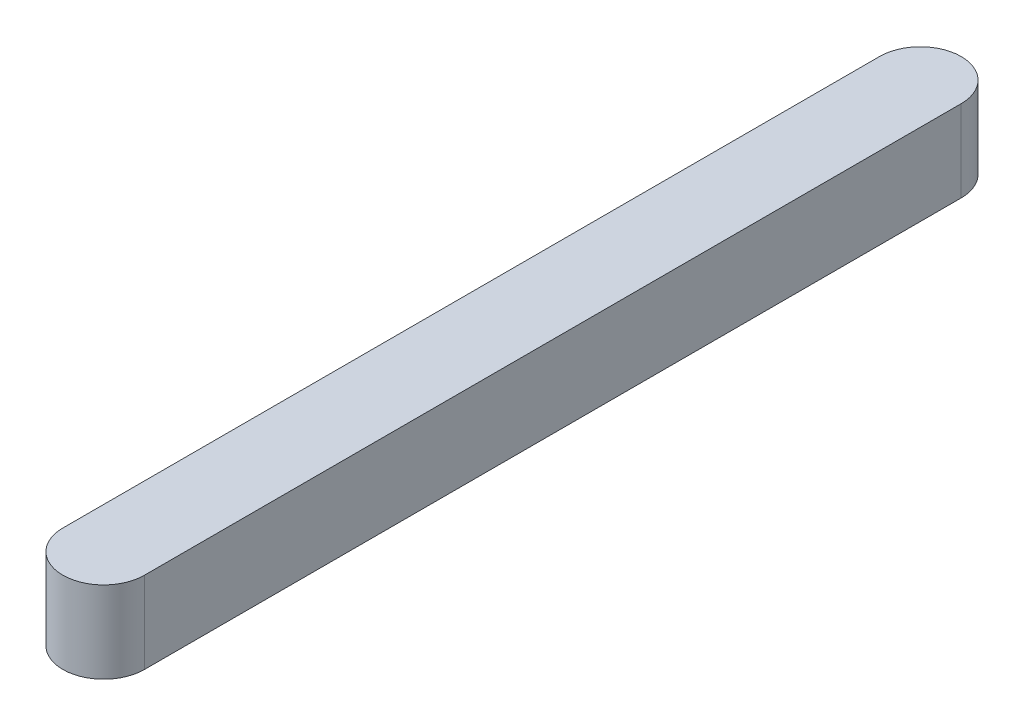
ISO-10303-21;
HEADER;
FILE_DESCRIPTION(('STEP AP214'),'2;1');
FILE_NAME('part.step','',(''),(''),'','','');
FILE_SCHEMA(('AUTOMOTIVE_DESIGN { 1 0 10303 214 1 1 1 1 }'));
ENDSEC;
DATA;
#1=APPLICATION_CONTEXT('core data for automotive mechanical design processes');
#2=APPLICATION_PROTOCOL_DEFINITION('international standard','automotive_design',2000,#1);
#3=PRODUCT_CONTEXT('',#1,'mechanical');
#4=PRODUCT('Part','Part','',(#3));
#5=PRODUCT_RELATED_PRODUCT_CATEGORY('part','',(#4));
#6=PRODUCT_DEFINITION_FORMATION('','',#4);
#7=PRODUCT_DEFINITION_CONTEXT('part definition',#1,'design');
#8=PRODUCT_DEFINITION('design','',#6,#7);
#9=PRODUCT_DEFINITION_SHAPE('','',#8);
#10=(LENGTH_UNIT() NAMED_UNIT(*) SI_UNIT(.MILLI.,.METRE.));
#11=(NAMED_UNIT(*) PLANE_ANGLE_UNIT() SI_UNIT($,.RADIAN.));
#12=(NAMED_UNIT(*) SI_UNIT($,.STERADIAN.) SOLID_ANGLE_UNIT());
#13=UNCERTAINTY_MEASURE_WITH_UNIT(LENGTH_MEASURE(1.E-05),#10,'distance_accuracy_value','');
#14=(GEOMETRIC_REPRESENTATION_CONTEXT(3) GLOBAL_UNCERTAINTY_ASSIGNED_CONTEXT((#13)) GLOBAL_UNIT_ASSIGNED_CONTEXT((#10,
#11,#12)) REPRESENTATION_CONTEXT('',''));
#15=CARTESIAN_POINT('',(0.,0.,0.));
#16=DIRECTION('',(0.,0.,1.));
#17=DIRECTION('',(1.,0.,0.));
#18=AXIS2_PLACEMENT_3D('',#15,#16,#17);
#19=CARTESIAN_POINT('',(1.5875,0.,-33.3375));
#20=DIRECTION('',(0.,1.,0.));
#21=DIRECTION('',(0.,0.,1.));
#22=AXIS2_PLACEMENT_3D('',#19,#20,#21);
#23=CYLINDRICAL_SURFACE('',#22,1.5875);
#24=DIRECTION('',(0.,1.,0.));
#25=VECTOR('',#24,1.);
#26=CARTESIAN_POINT('',(3.175,0.,-33.3375));
#27=LINE('',#26,#25);
#28=CARTESIAN_POINT('',(3.175,0.,-33.3375));
#29=VERTEX_POINT('',#28);
#30=CARTESIAN_POINT('',(3.175,3.175,-33.3375));
#31=VERTEX_POINT('',#30);
#32=EDGE_CURVE('E87',#29,#31,#27,.T.);
#33=ORIENTED_EDGE('',*,*,#32,.F.);
#34=CARTESIAN_POINT('',(1.5875,0.,-33.3375));
#35=DIRECTION('',(0.,1.,0.));
#36=DIRECTION('',(0.,0.,1.));
#37=AXIS2_PLACEMENT_3D('',#34,#35,#36);
#38=CIRCLE('',#37,1.5875);
#39=CARTESIAN_POINT('',(0.,0.,-33.3375));
#40=VERTEX_POINT('',#39);
#41=EDGE_CURVE('E46',#40,#29,#38,.F.);
#42=ORIENTED_EDGE('',*,*,#41,.F.);
#43=DIRECTION('',(0.,-1.,0.));
#44=VECTOR('',#43,1.);
#45=CARTESIAN_POINT('',(0.,0.,-33.3375));
#46=LINE('',#45,#44);
#47=CARTESIAN_POINT('',(0.,3.175,-33.3375));
#48=VERTEX_POINT('',#47);
#49=EDGE_CURVE('E109',#48,#40,#46,.T.);
#50=ORIENTED_EDGE('',*,*,#49,.F.);
#51=CARTESIAN_POINT('',(1.5875,3.175,-33.3375));
#52=DIRECTION('',(0.,-1.,0.));
#53=DIRECTION('',(0.,0.,-1.));
#54=AXIS2_PLACEMENT_3D('',#51,#52,#53);
#55=CIRCLE('',#54,1.5875);
#56=EDGE_CURVE('E11',#31,#48,#55,.F.);
#57=ORIENTED_EDGE('',*,*,#56,.F.);
#58=EDGE_LOOP('',(#33,#42,#50,#57));
#59=FACE_BOUND('',#58,.T.);
#60=ADVANCED_FACE('F38',(#59),#23,.T.);
#61=CARTESIAN_POINT('',(1.5875,3.175,-1.5875));
#62=DIRECTION('',(0.,-1.,0.));
#63=DIRECTION('',(0.,0.,-1.));
#64=AXIS2_PLACEMENT_3D('',#61,#62,#63);
#65=CYLINDRICAL_SURFACE('',#64,1.5875);
#66=DIRECTION('',(0.,-1.,0.));
#67=VECTOR('',#66,1.);
#68=CARTESIAN_POINT('',(3.175,0.,-1.5875));
#69=LINE('',#68,#67);
#70=CARTESIAN_POINT('',(3.175,3.175,-1.5875));
#71=VERTEX_POINT('',#70);
#72=CARTESIAN_POINT('',(3.175,0.,-1.5875));
#73=VERTEX_POINT('',#72);
#74=EDGE_CURVE('E80',#71,#73,#69,.T.);
#75=ORIENTED_EDGE('',*,*,#74,.F.);
#76=CARTESIAN_POINT('',(1.5875,3.175,-1.5875));
#77=DIRECTION('',(0.,-1.,0.));
#78=DIRECTION('',(0.,0.,-1.));
#79=AXIS2_PLACEMENT_3D('',#76,#77,#78);
#80=CIRCLE('',#79,1.5875);
#81=CARTESIAN_POINT('',(0.,3.175,-1.5875));
#82=VERTEX_POINT('',#81);
#83=EDGE_CURVE('E88',#82,#71,#80,.F.);
#84=ORIENTED_EDGE('',*,*,#83,.F.);
#85=DIRECTION('',(0.,1.,0.));
#86=VECTOR('',#85,1.);
#87=CARTESIAN_POINT('',(0.,3.175,-1.5875));
#88=LINE('',#87,#86);
#89=CARTESIAN_POINT('',(0.,0.,-1.5875));
#90=VERTEX_POINT('',#89);
#91=EDGE_CURVE('E82',#90,#82,#88,.T.);
#92=ORIENTED_EDGE('',*,*,#91,.F.);
#93=CARTESIAN_POINT('',(1.5875,0.,-1.5875));
#94=DIRECTION('',(0.,1.,0.));
#95=DIRECTION('',(0.,0.,1.));
#96=AXIS2_PLACEMENT_3D('',#93,#94,#95);
#97=CIRCLE('',#96,1.5875);
#98=EDGE_CURVE('E76',#73,#90,#97,.F.);
#99=ORIENTED_EDGE('',*,*,#98,.F.);
#100=EDGE_LOOP('',(#75,#84,#92,#99));
#101=FACE_BOUND('',#100,.T.);
#102=ADVANCED_FACE('F78',(#101),#65,.T.);
#103=CARTESIAN_POINT('',(3.175,0.,0.));
#104=DIRECTION('',(0.,1.,0.));
#105=DIRECTION('',(0.,0.,1.));
#106=AXIS2_PLACEMENT_3D('',#103,#104,#105);
#107=PLANE('',#106);
#108=DIRECTION('',(0.,0.,-1.));
#109=VECTOR('',#108,1.);
#110=CARTESIAN_POINT('',(0.,0.,0.));
#111=LINE('',#110,#109);
#112=EDGE_CURVE('E102',#90,#40,#111,.T.);
#113=ORIENTED_EDGE('',*,*,#112,.T.);
#114=ORIENTED_EDGE('',*,*,#41,.T.);
#115=DIRECTION('',(0.,0.,-1.));
#116=VECTOR('',#115,1.);
#117=CARTESIAN_POINT('',(3.175,0.,0.));
#118=LINE('',#117,#116);
#119=EDGE_CURVE('E94',#73,#29,#118,.T.);
#120=ORIENTED_EDGE('',*,*,#119,.F.);
#121=ORIENTED_EDGE('',*,*,#98,.T.);
#122=EDGE_LOOP('',(#113,#114,#120,#121));
#123=FACE_BOUND('',#122,.T.);
#124=ADVANCED_FACE('F98',(#123),#107,.F.);
#125=CARTESIAN_POINT('',(3.175,3.175,0.));
#126=DIRECTION('',(0.,-1.,0.));
#127=DIRECTION('',(0.,0.,-1.));
#128=AXIS2_PLACEMENT_3D('',#125,#126,#127);
#129=PLANE('',#128);
#130=DIRECTION('',(0.,0.,1.));
#131=VECTOR('',#130,1.);
#132=CARTESIAN_POINT('',(3.175,3.175,0.));
#133=LINE('',#132,#131);
#134=EDGE_CURVE('E95',#31,#71,#133,.T.);
#135=ORIENTED_EDGE('',*,*,#134,.F.);
#136=ORIENTED_EDGE('',*,*,#56,.T.);
#137=DIRECTION('',(0.,0.,1.));
#138=VECTOR('',#137,1.);
#139=CARTESIAN_POINT('',(0.,3.175,0.));
#140=LINE('',#139,#138);
#141=EDGE_CURVE('E99',#48,#82,#140,.T.);
#142=ORIENTED_EDGE('',*,*,#141,.T.);
#143=ORIENTED_EDGE('',*,*,#83,.T.);
#144=EDGE_LOOP('',(#135,#136,#142,#143));
#145=FACE_BOUND('',#144,.T.);
#146=ADVANCED_FACE('F113',(#145),#129,.F.);
#147=CARTESIAN_POINT('',(3.175,0.,0.));
#148=DIRECTION('',(-1.,0.,0.));
#149=DIRECTION('',(0.,0.,1.));
#150=AXIS2_PLACEMENT_3D('',#147,#148,#149);
#151=PLANE('',#150);
#152=ORIENTED_EDGE('',*,*,#119,.T.);
#153=ORIENTED_EDGE('',*,*,#32,.T.);
#154=ORIENTED_EDGE('',*,*,#134,.T.);
#155=ORIENTED_EDGE('',*,*,#74,.T.);
#156=EDGE_LOOP('',(#152,#153,#154,#155));
#157=FACE_BOUND('',#156,.T.);
#158=ADVANCED_FACE('F92',(#157),#151,.F.);
#159=CARTESIAN_POINT('',(0.,0.,0.));
#160=DIRECTION('',(-1.,0.,0.));
#161=DIRECTION('',(0.,0.,1.));
#162=AXIS2_PLACEMENT_3D('',#159,#160,#161);
#163=PLANE('',#162);
#164=ORIENTED_EDGE('',*,*,#141,.F.);
#165=ORIENTED_EDGE('',*,*,#49,.T.);
#166=ORIENTED_EDGE('',*,*,#112,.F.);
#167=ORIENTED_EDGE('',*,*,#91,.T.);
#168=EDGE_LOOP('',(#164,#165,#166,#167));
#169=FACE_BOUND('',#168,.T.);
#170=ADVANCED_FACE('F112',(#169),#163,.T.);
#171=CLOSED_SHELL('',(#60,#102,#124,#146,#158,#170));
#172=MANIFOLD_SOLID_BREP('B2',#171);
#173=ADVANCED_BREP_SHAPE_REPRESENTATION('',(#18,#172),#14);
#174=SHAPE_DEFINITION_REPRESENTATION(#9,#173);
ENDSEC;
END-ISO-10303-21;
